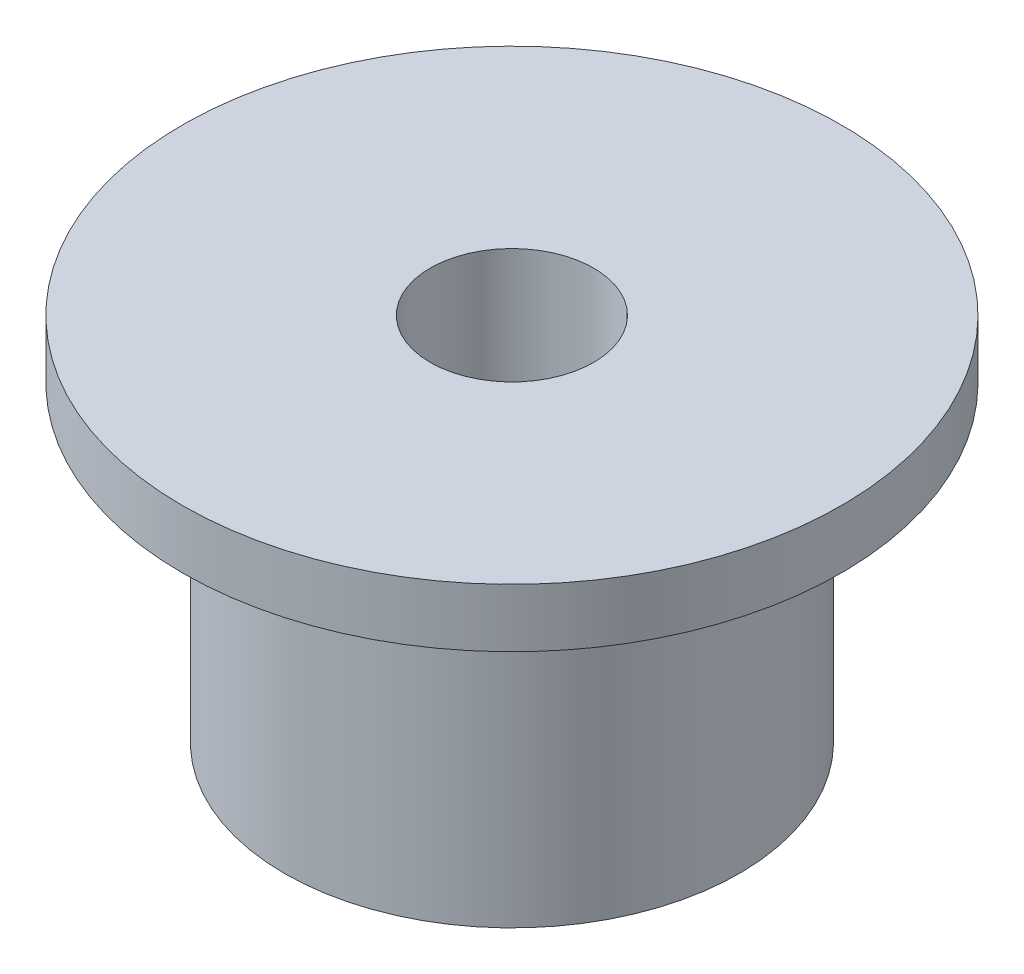
ISO-10303-21;
HEADER;
FILE_DESCRIPTION(('STEP AP214'),'2;1');
FILE_NAME('part.step','',(''),(''),'','','');
FILE_SCHEMA(('AUTOMOTIVE_DESIGN { 1 0 10303 214 1 1 1 1 }'));
ENDSEC;
DATA;
#1=APPLICATION_CONTEXT('core data for automotive mechanical design processes');
#2=APPLICATION_PROTOCOL_DEFINITION('international standard','automotive_design',2000,#1);
#3=PRODUCT_CONTEXT('',#1,'mechanical');
#4=PRODUCT('Part','Part','',(#3));
#5=PRODUCT_RELATED_PRODUCT_CATEGORY('part','',(#4));
#6=PRODUCT_DEFINITION_FORMATION('','',#4);
#7=PRODUCT_DEFINITION_CONTEXT('part definition',#1,'design');
#8=PRODUCT_DEFINITION('design','',#6,#7);
#9=PRODUCT_DEFINITION_SHAPE('','',#8);
#10=(LENGTH_UNIT() NAMED_UNIT(*) SI_UNIT(.MILLI.,.METRE.));
#11=(NAMED_UNIT(*) PLANE_ANGLE_UNIT() SI_UNIT($,.RADIAN.));
#12=(NAMED_UNIT(*) SI_UNIT($,.STERADIAN.) SOLID_ANGLE_UNIT());
#13=UNCERTAINTY_MEASURE_WITH_UNIT(LENGTH_MEASURE(1.E-05),#10,'distance_accuracy_value','');
#14=(GEOMETRIC_REPRESENTATION_CONTEXT(3) GLOBAL_UNCERTAINTY_ASSIGNED_CONTEXT((#13)) GLOBAL_UNIT_ASSIGNED_CONTEXT((#10,
#11,#12)) REPRESENTATION_CONTEXT('',''));
#15=CARTESIAN_POINT('',(0.,0.,0.));
#16=DIRECTION('',(0.,0.,1.));
#17=DIRECTION('',(1.,0.,0.));
#18=AXIS2_PLACEMENT_3D('',#15,#16,#17);
#19=CARTESIAN_POINT('',(0.,4.000000128,0.));
#20=DIRECTION('',(0.,-1.,0.));
#21=DIRECTION('',(0.,0.,-1.));
#22=AXIS2_PLACEMENT_3D('',#19,#20,#21);
#23=CYLINDRICAL_SURFACE('',#22,2.921);
#24=CARTESIAN_POINT('',(0.,4.000000128,0.));
#25=DIRECTION('',(0.,1.,0.));
#26=DIRECTION('',(0.,0.,1.));
#27=AXIS2_PLACEMENT_3D('',#24,#25,#26);
#28=CIRCLE('',#27,2.921);
#29=CARTESIAN_POINT('',(0.,4.000000128,2.921));
#30=VERTEX_POINT('',#29);
#31=EDGE_CURVE('E10',#30,#30,#28,.T.);
#32=ORIENTED_EDGE('',*,*,#31,.F.);
#33=EDGE_LOOP('',(#32));
#34=FACE_BOUND('',#33,.T.);
#35=CARTESIAN_POINT('',(0.,0.,0.));
#36=DIRECTION('',(0.,1.,0.));
#37=DIRECTION('',(0.,0.,1.));
#38=AXIS2_PLACEMENT_3D('',#35,#36,#37);
#39=CIRCLE('',#38,2.921);
#40=CARTESIAN_POINT('',(0.,0.,2.921));
#41=VERTEX_POINT('',#40);
#42=EDGE_CURVE('E52',#41,#41,#39,.T.);
#43=ORIENTED_EDGE('',*,*,#42,.T.);
#44=EDGE_LOOP('',(#43));
#45=FACE_BOUND('',#44,.T.);
#46=ADVANCED_FACE('F49',(#34,#45),#23,.T.);
#47=CARTESIAN_POINT('',(0.,0.,0.));
#48=DIRECTION('',(0.,1.,0.));
#49=DIRECTION('',(0.,0.,1.));
#50=AXIS2_PLACEMENT_3D('',#47,#48,#49);
#51=PLANE('',#50);
#52=CARTESIAN_POINT('',(0.,0.,0.));
#53=DIRECTION('',(0.,1.,0.));
#54=DIRECTION('',(0.,0.,1.));
#55=AXIS2_PLACEMENT_3D('',#52,#53,#54);
#56=CIRCLE('',#55,1.05);
#57=CARTESIAN_POINT('',(0.,0.,1.05));
#58=VERTEX_POINT('',#57);
#59=EDGE_CURVE('E67',#58,#58,#56,.T.);
#60=ORIENTED_EDGE('',*,*,#59,.T.);
#61=EDGE_LOOP('',(#60));
#62=FACE_BOUND('',#61,.T.);
#63=ORIENTED_EDGE('',*,*,#42,.F.);
#64=EDGE_LOOP('',(#63));
#65=FACE_BOUND('',#64,.T.);
#66=ADVANCED_FACE('F79',(#62,#65),#51,.F.);
#67=CARTESIAN_POINT('',(0.,4.749998628,0.));
#68=DIRECTION('',(0.,-1.,0.));
#69=DIRECTION('',(0.,0.,-1.));
#70=AXIS2_PLACEMENT_3D('',#67,#68,#69);
#71=CYLINDRICAL_SURFACE('',#70,4.2333418);
#72=CARTESIAN_POINT('',(0.,4.749998628,0.));
#73=DIRECTION('',(0.,1.,0.));
#74=DIRECTION('',(0.,0.,1.));
#75=AXIS2_PLACEMENT_3D('',#72,#73,#74);
#76=CIRCLE('',#75,4.2333418);
#77=CARTESIAN_POINT('',(0.,4.749998628,4.2333418));
#78=VERTEX_POINT('',#77);
#79=EDGE_CURVE('E61',#78,#78,#76,.T.);
#80=ORIENTED_EDGE('',*,*,#79,.F.);
#81=EDGE_LOOP('',(#80));
#82=FACE_BOUND('',#81,.T.);
#83=CARTESIAN_POINT('',(0.,4.000000128,0.));
#84=DIRECTION('',(0.,1.,0.));
#85=DIRECTION('',(0.,0.,1.));
#86=AXIS2_PLACEMENT_3D('',#83,#84,#85);
#87=CIRCLE('',#86,4.2333418);
#88=CARTESIAN_POINT('',(0.,4.000000128,4.2333418));
#89=VERTEX_POINT('',#88);
#90=EDGE_CURVE('E63',#89,#89,#87,.T.);
#91=ORIENTED_EDGE('',*,*,#90,.T.);
#92=EDGE_LOOP('',(#91));
#93=FACE_BOUND('',#92,.T.);
#94=ADVANCED_FACE('F92',(#82,#93),#71,.T.);
#95=CARTESIAN_POINT('',(0.,4.749998628,0.));
#96=DIRECTION('',(0.,1.,0.));
#97=DIRECTION('',(0.,0.,1.));
#98=AXIS2_PLACEMENT_3D('',#95,#96,#97);
#99=PLANE('',#98);
#100=CARTESIAN_POINT('',(0.,4.749998628,0.));
#101=DIRECTION('',(0.,1.,0.));
#102=DIRECTION('',(0.,0.,1.));
#103=AXIS2_PLACEMENT_3D('',#100,#101,#102);
#104=CIRCLE('',#103,1.05);
#105=CARTESIAN_POINT('',(0.,4.749998628,1.05));
#106=VERTEX_POINT('',#105);
#107=EDGE_CURVE('E71',#106,#106,#104,.T.);
#108=ORIENTED_EDGE('',*,*,#107,.F.);
#109=EDGE_LOOP('',(#108));
#110=FACE_BOUND('',#109,.T.);
#111=ORIENTED_EDGE('',*,*,#79,.T.);
#112=EDGE_LOOP('',(#111));
#113=FACE_BOUND('',#112,.T.);
#114=ADVANCED_FACE('F89',(#110,#113),#99,.T.);
#115=CARTESIAN_POINT('',(0.,4.000000128,0.));
#116=DIRECTION('',(0.,1.,0.));
#117=DIRECTION('',(0.,0.,1.));
#118=AXIS2_PLACEMENT_3D('',#115,#116,#117);
#119=PLANE('',#118);
#120=ORIENTED_EDGE('',*,*,#31,.T.);
#121=EDGE_LOOP('',(#120));
#122=FACE_BOUND('',#121,.T.);
#123=ORIENTED_EDGE('',*,*,#90,.F.);
#124=EDGE_LOOP('',(#123));
#125=FACE_BOUND('',#124,.T.);
#126=ADVANCED_FACE('F85',(#122,#125),#119,.F.);
#127=CARTESIAN_POINT('',(0.,0.,0.));
#128=DIRECTION('',(0.,1.,0.));
#129=DIRECTION('',(0.,0.,1.));
#130=AXIS2_PLACEMENT_3D('',#127,#128,#129);
#131=CYLINDRICAL_SURFACE('',#130,1.05);
#132=ORIENTED_EDGE('',*,*,#59,.F.);
#133=EDGE_LOOP('',(#132));
#134=FACE_BOUND('',#133,.T.);
#135=ORIENTED_EDGE('',*,*,#107,.T.);
#136=EDGE_LOOP('',(#135));
#137=FACE_BOUND('',#136,.T.);
#138=ADVANCED_FACE('F82',(#134,#137),#131,.F.);
#139=CLOSED_SHELL('',(#46,#66,#94,#114,#126,#138));
#140=MANIFOLD_SOLID_BREP('B2',#139);
#141=ADVANCED_BREP_SHAPE_REPRESENTATION('',(#18,#140),#14);
#142=SHAPE_DEFINITION_REPRESENTATION(#9,#141);
ENDSEC;
END-ISO-10303-21;
